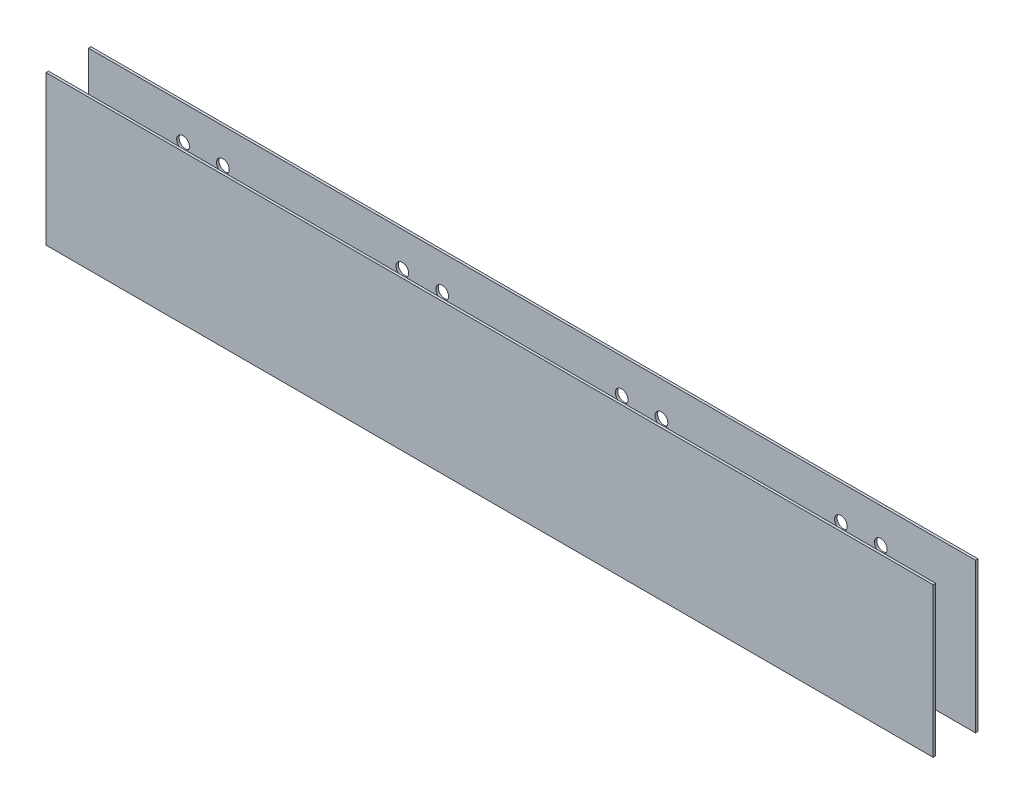
ISO-10303-21;
HEADER;
FILE_DESCRIPTION(('STEP AP214'),'2;1');
FILE_NAME('part.step','',(''),(''),'','','');
FILE_SCHEMA(('AUTOMOTIVE_DESIGN { 1 0 10303 214 1 1 1 1 }'));
ENDSEC;
DATA;
#1=APPLICATION_CONTEXT('core data for automotive mechanical design processes');
#2=APPLICATION_PROTOCOL_DEFINITION('international standard','automotive_design',2000,#1);
#3=PRODUCT_CONTEXT('',#1,'mechanical');
#4=PRODUCT('Part','Part','',(#3));
#5=PRODUCT_RELATED_PRODUCT_CATEGORY('part','',(#4));
#6=PRODUCT_DEFINITION_FORMATION('','',#4);
#7=PRODUCT_DEFINITION_CONTEXT('part definition',#1,'design');
#8=PRODUCT_DEFINITION('design','',#6,#7);
#9=PRODUCT_DEFINITION_SHAPE('','',#8);
#10=(LENGTH_UNIT() NAMED_UNIT(*) SI_UNIT(.MILLI.,.METRE.));
#11=(NAMED_UNIT(*) PLANE_ANGLE_UNIT() SI_UNIT($,.RADIAN.));
#12=(NAMED_UNIT(*) SI_UNIT($,.STERADIAN.) SOLID_ANGLE_UNIT());
#13=UNCERTAINTY_MEASURE_WITH_UNIT(LENGTH_MEASURE(1.E-05),#10,'distance_accuracy_value','');
#14=(GEOMETRIC_REPRESENTATION_CONTEXT(3) GLOBAL_UNCERTAINTY_ASSIGNED_CONTEXT((#13)) GLOBAL_UNIT_ASSIGNED_CONTEXT((#10,
#11,#12)) REPRESENTATION_CONTEXT('',''));
#15=CARTESIAN_POINT('',(0.,0.,0.));
#16=DIRECTION('',(0.,0.,1.));
#17=DIRECTION('',(1.,0.,0.));
#18=AXIS2_PLACEMENT_3D('',#15,#16,#17);
#19=CARTESIAN_POINT('',(890.,150.,40.));
#20=DIRECTION('',(-1.,0.,0.));
#21=DIRECTION('',(0.,0.,1.));
#22=AXIS2_PLACEMENT_3D('',#19,#20,#21);
#23=PLANE('',#22);
#24=DIRECTION('',(0.,0.,-1.));
#25=VECTOR('',#24,1.);
#26=CARTESIAN_POINT('',(890.,-150.,40.));
#27=LINE('',#26,#25);
#28=CARTESIAN_POINT('',(890.,-150.,45.));
#29=VERTEX_POINT('',#28);
#30=CARTESIAN_POINT('',(890.,-150.,40.));
#31=VERTEX_POINT('',#30);
#32=EDGE_CURVE('E12',#29,#31,#27,.T.);
#33=ORIENTED_EDGE('',*,*,#32,.T.);
#34=DIRECTION('',(0.,-1.,0.));
#35=VECTOR('',#34,1.);
#36=CARTESIAN_POINT('',(890.,150.,40.));
#37=LINE('',#36,#35);
#38=CARTESIAN_POINT('',(890.,150.,40.));
#39=VERTEX_POINT('',#38);
#40=EDGE_CURVE('E132',#39,#31,#37,.T.);
#41=ORIENTED_EDGE('',*,*,#40,.F.);
#42=DIRECTION('',(0.,0.,-1.));
#43=VECTOR('',#42,1.);
#44=CARTESIAN_POINT('',(890.,150.,40.));
#45=LINE('',#44,#43);
#46=CARTESIAN_POINT('',(890.,150.,45.));
#47=VERTEX_POINT('',#46);
#48=EDGE_CURVE('E56',#47,#39,#45,.T.);
#49=ORIENTED_EDGE('',*,*,#48,.F.);
#50=DIRECTION('',(0.,-1.,0.));
#51=VECTOR('',#50,1.);
#52=CARTESIAN_POINT('',(890.,150.,45.));
#53=LINE('',#52,#51);
#54=EDGE_CURVE('E114',#47,#29,#53,.T.);
#55=ORIENTED_EDGE('',*,*,#54,.T.);
#56=EDGE_LOOP('',(#33,#41,#49,#55));
#57=FACE_BOUND('',#56,.T.);
#58=ADVANCED_FACE('F52',(#57),#23,.F.);
#59=CARTESIAN_POINT('',(-890.,150.,40.));
#60=DIRECTION('',(0.,0.,1.));
#61=DIRECTION('',(1.,0.,0.));
#62=AXIS2_PLACEMENT_3D('',#59,#60,#61);
#63=PLANE('',#62);
#64=DIRECTION('',(-1.,0.,0.));
#65=VECTOR('',#64,1.);
#66=CARTESIAN_POINT('',(-890.,-150.,40.));
#67=LINE('',#66,#65);
#68=CARTESIAN_POINT('',(-890.,-150.,40.));
#69=VERTEX_POINT('',#68);
#70=EDGE_CURVE('E63',#31,#69,#67,.T.);
#71=ORIENTED_EDGE('',*,*,#70,.T.);
#72=DIRECTION('',(0.,-1.,0.));
#73=VECTOR('',#72,1.);
#74=CARTESIAN_POINT('',(-890.,150.,40.));
#75=LINE('',#74,#73);
#76=CARTESIAN_POINT('',(-890.,150.,40.));
#77=VERTEX_POINT('',#76);
#78=EDGE_CURVE('E108',#77,#69,#75,.T.);
#79=ORIENTED_EDGE('',*,*,#78,.F.);
#80=DIRECTION('',(-1.,0.,0.));
#81=VECTOR('',#80,1.);
#82=CARTESIAN_POINT('',(-890.,150.,40.));
#83=LINE('',#82,#81);
#84=EDGE_CURVE('E87',#39,#77,#83,.T.);
#85=ORIENTED_EDGE('',*,*,#84,.F.);
#86=ORIENTED_EDGE('',*,*,#40,.T.);
#87=EDGE_LOOP('',(#71,#79,#85,#86));
#88=FACE_BOUND('',#87,.T.);
#89=ADVANCED_FACE('F136',(#88),#63,.F.);
#90=CARTESIAN_POINT('',(-890.,150.,40.));
#91=DIRECTION('',(1.,0.,0.));
#92=DIRECTION('',(0.,0.,-1.));
#93=AXIS2_PLACEMENT_3D('',#90,#91,#92);
#94=PLANE('',#93);
#95=DIRECTION('',(0.,0.,1.));
#96=VECTOR('',#95,1.);
#97=CARTESIAN_POINT('',(-890.,-150.,40.));
#98=LINE('',#97,#96);
#99=CARTESIAN_POINT('',(-890.,-150.,45.));
#100=VERTEX_POINT('',#99);
#101=EDGE_CURVE('E103',#69,#100,#98,.T.);
#102=ORIENTED_EDGE('',*,*,#101,.T.);
#103=DIRECTION('',(0.,-1.,0.));
#104=VECTOR('',#103,1.);
#105=CARTESIAN_POINT('',(-890.,150.,45.));
#106=LINE('',#105,#104);
#107=CARTESIAN_POINT('',(-890.,150.,45.));
#108=VERTEX_POINT('',#107);
#109=EDGE_CURVE('E106',#108,#100,#106,.T.);
#110=ORIENTED_EDGE('',*,*,#109,.F.);
#111=DIRECTION('',(0.,0.,1.));
#112=VECTOR('',#111,1.);
#113=CARTESIAN_POINT('',(-890.,150.,40.));
#114=LINE('',#113,#112);
#115=EDGE_CURVE('E126',#77,#108,#114,.T.);
#116=ORIENTED_EDGE('',*,*,#115,.F.);
#117=ORIENTED_EDGE('',*,*,#78,.T.);
#118=EDGE_LOOP('',(#102,#110,#116,#117));
#119=FACE_BOUND('',#118,.T.);
#120=ADVANCED_FACE('F104',(#119),#94,.F.);
#121=CARTESIAN_POINT('',(-890.,150.,45.));
#122=DIRECTION('',(0.,0.,-1.));
#123=DIRECTION('',(-1.,0.,0.));
#124=AXIS2_PLACEMENT_3D('',#121,#122,#123);
#125=PLANE('',#124);
#126=DIRECTION('',(1.,0.,0.));
#127=VECTOR('',#126,1.);
#128=CARTESIAN_POINT('',(-890.,-150.,45.));
#129=LINE('',#128,#127);
#130=EDGE_CURVE('E97',#100,#29,#129,.T.);
#131=ORIENTED_EDGE('',*,*,#130,.T.);
#132=ORIENTED_EDGE('',*,*,#54,.F.);
#133=DIRECTION('',(1.,0.,0.));
#134=VECTOR('',#133,1.);
#135=CARTESIAN_POINT('',(-890.,150.,45.));
#136=LINE('',#135,#134);
#137=EDGE_CURVE('E112',#108,#47,#136,.T.);
#138=ORIENTED_EDGE('',*,*,#137,.F.);
#139=ORIENTED_EDGE('',*,*,#109,.T.);
#140=EDGE_LOOP('',(#131,#132,#138,#139));
#141=FACE_BOUND('',#140,.T.);
#142=ADVANCED_FACE('F111',(#141),#125,.F.);
#143=CARTESIAN_POINT('',(0.,150.,0.));
#144=DIRECTION('',(0.,1.,0.));
#145=DIRECTION('',(0.,0.,1.));
#146=AXIS2_PLACEMENT_3D('',#143,#144,#145);
#147=PLANE('',#146);
#148=ORIENTED_EDGE('',*,*,#48,.T.);
#149=ORIENTED_EDGE('',*,*,#84,.T.);
#150=ORIENTED_EDGE('',*,*,#115,.T.);
#151=ORIENTED_EDGE('',*,*,#137,.T.);
#152=EDGE_LOOP('',(#148,#149,#150,#151));
#153=FACE_BOUND('',#152,.T.);
#154=ADVANCED_FACE('F54',(#153),#147,.T.);
#155=CARTESIAN_POINT('',(0.,-150.,0.));
#156=DIRECTION('',(0.,1.,0.));
#157=DIRECTION('',(0.,0.,1.));
#158=AXIS2_PLACEMENT_3D('',#155,#156,#157);
#159=PLANE('',#158);
#160=ORIENTED_EDGE('',*,*,#32,.F.);
#161=ORIENTED_EDGE('',*,*,#130,.F.);
#162=ORIENTED_EDGE('',*,*,#101,.F.);
#163=ORIENTED_EDGE('',*,*,#70,.F.);
#164=EDGE_LOOP('',(#160,#161,#162,#163));
#165=FACE_BOUND('',#164,.T.);
#166=ADVANCED_FACE('F116',(#165),#159,.F.);
#167=CLOSED_SHELL('',(#58,#89,#120,#142,#154,#166));
#168=MANIFOLD_SOLID_BREP('B2',#167);
#169=CARTESIAN_POINT('',(889.999999999999,150.,-45.));
#170=DIRECTION('',(-1.,0.,0.));
#171=DIRECTION('',(0.,0.,1.));
#172=AXIS2_PLACEMENT_3D('',#169,#170,#171);
#173=PLANE('',#172);
#174=DIRECTION('',(0.,0.,-1.));
#175=VECTOR('',#174,1.);
#176=CARTESIAN_POINT('',(889.999999999999,-150.,-45.));
#177=LINE('',#176,#175);
#178=CARTESIAN_POINT('',(889.999999999999,-150.,-40.));
#179=VERTEX_POINT('',#178);
#180=CARTESIAN_POINT('',(889.999999999999,-150.,-45.));
#181=VERTEX_POINT('',#180);
#182=EDGE_CURVE('E265',#179,#181,#177,.T.);
#183=ORIENTED_EDGE('',*,*,#182,.T.);
#184=DIRECTION('',(0.,-1.,0.));
#185=VECTOR('',#184,1.);
#186=CARTESIAN_POINT('',(889.999999999999,150.,-45.));
#187=LINE('',#186,#185);
#188=CARTESIAN_POINT('',(889.999999999999,150.,-45.));
#189=VERTEX_POINT('',#188);
#190=EDGE_CURVE('E50',#189,#181,#187,.T.);
#191=ORIENTED_EDGE('',*,*,#190,.F.);
#192=DIRECTION('',(0.,0.,-1.));
#193=VECTOR('',#192,1.);
#194=CARTESIAN_POINT('',(889.999999999999,150.,-45.));
#195=LINE('',#194,#193);
#196=CARTESIAN_POINT('',(889.999999999999,150.,-40.));
#197=VERTEX_POINT('',#196);
#198=EDGE_CURVE('E252',#197,#189,#195,.T.);
#199=ORIENTED_EDGE('',*,*,#198,.F.);
#200=DIRECTION('',(0.,-1.,0.));
#201=VECTOR('',#200,1.);
#202=CARTESIAN_POINT('',(889.999999999999,150.,-40.));
#203=LINE('',#202,#201);
#204=EDGE_CURVE('E261',#197,#179,#203,.T.);
#205=ORIENTED_EDGE('',*,*,#204,.T.);
#206=EDGE_LOOP('',(#183,#191,#199,#205));
#207=FACE_BOUND('',#206,.T.);
#208=ADVANCED_FACE('F199',(#207),#173,.F.);
#209=CARTESIAN_POINT('',(-890.000000000001,150.,-45.));
#210=DIRECTION('',(0.,0.,1.));
#211=DIRECTION('',(1.,0.,0.));
#212=AXIS2_PLACEMENT_3D('',#209,#210,#211);
#213=PLANE('',#212);
#214=CARTESIAN_POINT('',(-700.1,80.,-45.));
#215=DIRECTION('',(0.,0.,1.));
#216=DIRECTION('',(1.,0.,0.));
#217=AXIS2_PLACEMENT_3D('',#214,#215,#216);
#218=CIRCLE('',#217,12.75);
#219=CARTESIAN_POINT('',(-687.35,80.,-45.));
#220=VERTEX_POINT('',#219);
#221=EDGE_CURVE('E268',#220,#220,#218,.T.);
#222=ORIENTED_EDGE('',*,*,#221,.T.);
#223=EDGE_LOOP('',(#222));
#224=FACE_BOUND('',#223,.T.);
#225=CARTESIAN_POINT('',(-620.1,80.,-45.));
#226=DIRECTION('',(0.,0.,1.));
#227=DIRECTION('',(1.,0.,0.));
#228=AXIS2_PLACEMENT_3D('',#225,#226,#227);
#229=CIRCLE('',#228,12.75);
#230=CARTESIAN_POINT('',(-607.35,80.,-45.));
#231=VERTEX_POINT('',#230);
#232=EDGE_CURVE('E299',#231,#231,#229,.T.);
#233=ORIENTED_EDGE('',*,*,#232,.T.);
#234=EDGE_LOOP('',(#233));
#235=FACE_BOUND('',#234,.T.);
#236=CARTESIAN_POINT('',(-260.1,80.,-45.));
#237=DIRECTION('',(0.,0.,1.));
#238=DIRECTION('',(1.,0.,0.));
#239=AXIS2_PLACEMENT_3D('',#236,#237,#238);
#240=CIRCLE('',#239,12.75);
#241=CARTESIAN_POINT('',(-247.35,80.,-45.));
#242=VERTEX_POINT('',#241);
#243=EDGE_CURVE('E296',#242,#242,#240,.T.);
#244=ORIENTED_EDGE('',*,*,#243,.T.);
#245=EDGE_LOOP('',(#244));
#246=FACE_BOUND('',#245,.T.);
#247=CARTESIAN_POINT('',(-180.1,80.,-45.));
#248=DIRECTION('',(0.,0.,1.));
#249=DIRECTION('',(1.,0.,0.));
#250=AXIS2_PLACEMENT_3D('',#247,#248,#249);
#251=CIRCLE('',#250,12.75);
#252=CARTESIAN_POINT('',(-167.35,80.,-45.));
#253=VERTEX_POINT('',#252);
#254=EDGE_CURVE('E293',#253,#253,#251,.T.);
#255=ORIENTED_EDGE('',*,*,#254,.T.);
#256=EDGE_LOOP('',(#255));
#257=FACE_BOUND('',#256,.T.);
#258=CARTESIAN_POINT('',(179.9,80.,-45.));
#259=DIRECTION('',(0.,0.,1.));
#260=DIRECTION('',(1.,0.,0.));
#261=AXIS2_PLACEMENT_3D('',#258,#259,#260);
#262=CIRCLE('',#261,12.75);
#263=CARTESIAN_POINT('',(192.65,80.,-45.));
#264=VERTEX_POINT('',#263);
#265=EDGE_CURVE('E289',#264,#264,#262,.T.);
#266=ORIENTED_EDGE('',*,*,#265,.T.);
#267=EDGE_LOOP('',(#266));
#268=FACE_BOUND('',#267,.T.);
#269=CARTESIAN_POINT('',(259.9,80.,-45.));
#270=DIRECTION('',(0.,0.,1.));
#271=DIRECTION('',(1.,0.,0.));
#272=AXIS2_PLACEMENT_3D('',#269,#270,#271);
#273=CIRCLE('',#272,12.75);
#274=CARTESIAN_POINT('',(272.65,80.,-45.));
#275=VERTEX_POINT('',#274);
#276=EDGE_CURVE('E285',#275,#275,#273,.T.);
#277=ORIENTED_EDGE('',*,*,#276,.T.);
#278=EDGE_LOOP('',(#277));
#279=FACE_BOUND('',#278,.T.);
#280=CARTESIAN_POINT('',(619.9,80.,-45.));
#281=DIRECTION('',(0.,0.,1.));
#282=DIRECTION('',(1.,0.,0.));
#283=AXIS2_PLACEMENT_3D('',#280,#281,#282);
#284=CIRCLE('',#283,12.7500000000003);
#285=CARTESIAN_POINT('',(632.650000000001,80.,-45.));
#286=VERTEX_POINT('',#285);
#287=EDGE_CURVE('E281',#286,#286,#284,.T.);
#288=ORIENTED_EDGE('',*,*,#287,.T.);
#289=EDGE_LOOP('',(#288));
#290=FACE_BOUND('',#289,.T.);
#291=CARTESIAN_POINT('',(699.9,80.,-45.));
#292=DIRECTION('',(0.,0.,1.));
#293=DIRECTION('',(1.,0.,0.));
#294=AXIS2_PLACEMENT_3D('',#291,#292,#293);
#295=CIRCLE('',#294,12.7500000000003);
#296=CARTESIAN_POINT('',(712.65,80.,-45.));
#297=VERTEX_POINT('',#296);
#298=EDGE_CURVE('E277',#297,#297,#295,.T.);
#299=ORIENTED_EDGE('',*,*,#298,.T.);
#300=EDGE_LOOP('',(#299));
#301=FACE_BOUND('',#300,.T.);
#302=DIRECTION('',(-1.,0.,0.));
#303=VECTOR('',#302,1.);
#304=CARTESIAN_POINT('',(-890.000000000001,-150.,-45.));
#305=LINE('',#304,#303);
#306=CARTESIAN_POINT('',(-890.000000000001,-150.,-45.));
#307=VERTEX_POINT('',#306);
#308=EDGE_CURVE('E256',#181,#307,#305,.T.);
#309=ORIENTED_EDGE('',*,*,#308,.T.);
#310=DIRECTION('',(0.,-1.,0.));
#311=VECTOR('',#310,1.);
#312=CARTESIAN_POINT('',(-890.000000000001,150.,-45.));
#313=LINE('',#312,#311);
#314=CARTESIAN_POINT('',(-890.000000000001,150.,-45.));
#315=VERTEX_POINT('',#314);
#316=EDGE_CURVE('E208',#315,#307,#313,.T.);
#317=ORIENTED_EDGE('',*,*,#316,.F.);
#318=DIRECTION('',(-1.,0.,0.));
#319=VECTOR('',#318,1.);
#320=CARTESIAN_POINT('',(-890.000000000001,150.,-45.));
#321=LINE('',#320,#319);
#322=EDGE_CURVE('E247',#189,#315,#321,.T.);
#323=ORIENTED_EDGE('',*,*,#322,.F.);
#324=ORIENTED_EDGE('',*,*,#190,.T.);
#325=EDGE_LOOP('',(#309,#317,#323,#324));
#326=FACE_BOUND('',#325,.T.);
#327=ADVANCED_FACE('F255',(#224,#235,#246,#257,#268,#279,#290,#301,#326),#213,.F.);
#328=CARTESIAN_POINT('',(-890.000000000001,150.,-45.));
#329=DIRECTION('',(1.,0.,0.));
#330=DIRECTION('',(0.,0.,-1.));
#331=AXIS2_PLACEMENT_3D('',#328,#329,#330);
#332=PLANE('',#331);
#333=DIRECTION('',(0.,0.,1.));
#334=VECTOR('',#333,1.);
#335=CARTESIAN_POINT('',(-890.000000000001,-150.,-45.));
#336=LINE('',#335,#334);
#337=CARTESIAN_POINT('',(-890.000000000001,-150.,-40.));
#338=VERTEX_POINT('',#337);
#339=EDGE_CURVE('E234',#307,#338,#336,.T.);
#340=ORIENTED_EDGE('',*,*,#339,.T.);
#341=DIRECTION('',(0.,-1.,0.));
#342=VECTOR('',#341,1.);
#343=CARTESIAN_POINT('',(-890.000000000001,150.,-40.));
#344=LINE('',#343,#342);
#345=CARTESIAN_POINT('',(-890.000000000001,150.,-40.));
#346=VERTEX_POINT('',#345);
#347=EDGE_CURVE('E257',#346,#338,#344,.T.);
#348=ORIENTED_EDGE('',*,*,#347,.F.);
#349=DIRECTION('',(0.,0.,1.));
#350=VECTOR('',#349,1.);
#351=CARTESIAN_POINT('',(-890.000000000001,150.,-45.));
#352=LINE('',#351,#350);
#353=EDGE_CURVE('E250',#315,#346,#352,.T.);
#354=ORIENTED_EDGE('',*,*,#353,.F.);
#355=ORIENTED_EDGE('',*,*,#316,.T.);
#356=EDGE_LOOP('',(#340,#348,#354,#355));
#357=FACE_BOUND('',#356,.T.);
#358=ADVANCED_FACE('F259',(#357),#332,.F.);
#359=CARTESIAN_POINT('',(-890.000000000001,150.,-40.));
#360=DIRECTION('',(0.,0.,-1.));
#361=DIRECTION('',(-1.,0.,0.));
#362=AXIS2_PLACEMENT_3D('',#359,#360,#361);
#363=PLANE('',#362);
#364=CARTESIAN_POINT('',(-700.1,80.,-40.));
#365=DIRECTION('',(0.,0.,-1.));
#366=DIRECTION('',(-1.,0.,0.));
#367=AXIS2_PLACEMENT_3D('',#364,#365,#366);
#368=CIRCLE('',#367,12.75);
#369=CARTESIAN_POINT('',(-712.85,80.,-40.));
#370=VERTEX_POINT('',#369);
#371=EDGE_CURVE('E202',#370,#370,#368,.T.);
#372=ORIENTED_EDGE('',*,*,#371,.T.);
#373=EDGE_LOOP('',(#372));
#374=FACE_BOUND('',#373,.T.);
#375=CARTESIAN_POINT('',(-620.1,80.,-40.));
#376=DIRECTION('',(0.,0.,-1.));
#377=DIRECTION('',(-1.,0.,0.));
#378=AXIS2_PLACEMENT_3D('',#375,#376,#377);
#379=CIRCLE('',#378,12.75);
#380=CARTESIAN_POINT('',(-632.85,80.,-40.));
#381=VERTEX_POINT('',#380);
#382=EDGE_CURVE('E297',#381,#381,#379,.T.);
#383=ORIENTED_EDGE('',*,*,#382,.T.);
#384=EDGE_LOOP('',(#383));
#385=FACE_BOUND('',#384,.T.);
#386=CARTESIAN_POINT('',(-260.1,80.,-40.));
#387=DIRECTION('',(0.,0.,-1.));
#388=DIRECTION('',(-1.,0.,0.));
#389=AXIS2_PLACEMENT_3D('',#386,#387,#388);
#390=CIRCLE('',#389,12.75);
#391=CARTESIAN_POINT('',(-272.85,80.,-40.));
#392=VERTEX_POINT('',#391);
#393=EDGE_CURVE('E294',#392,#392,#390,.T.);
#394=ORIENTED_EDGE('',*,*,#393,.T.);
#395=EDGE_LOOP('',(#394));
#396=FACE_BOUND('',#395,.T.);
#397=CARTESIAN_POINT('',(-180.1,80.,-40.));
#398=DIRECTION('',(0.,0.,-1.));
#399=DIRECTION('',(-1.,0.,0.));
#400=AXIS2_PLACEMENT_3D('',#397,#398,#399);
#401=CIRCLE('',#400,12.75);
#402=CARTESIAN_POINT('',(-192.85,80.,-40.));
#403=VERTEX_POINT('',#402);
#404=EDGE_CURVE('E290',#403,#403,#401,.T.);
#405=ORIENTED_EDGE('',*,*,#404,.T.);
#406=EDGE_LOOP('',(#405));
#407=FACE_BOUND('',#406,.T.);
#408=CARTESIAN_POINT('',(179.9,80.,-40.));
#409=DIRECTION('',(0.,0.,-1.));
#410=DIRECTION('',(-1.,0.,0.));
#411=AXIS2_PLACEMENT_3D('',#408,#409,#410);
#412=CIRCLE('',#411,12.75);
#413=CARTESIAN_POINT('',(167.15,80.,-40.));
#414=VERTEX_POINT('',#413);
#415=EDGE_CURVE('E286',#414,#414,#412,.T.);
#416=ORIENTED_EDGE('',*,*,#415,.T.);
#417=EDGE_LOOP('',(#416));
#418=FACE_BOUND('',#417,.T.);
#419=CARTESIAN_POINT('',(259.9,80.,-40.));
#420=DIRECTION('',(0.,0.,-1.));
#421=DIRECTION('',(-1.,0.,0.));
#422=AXIS2_PLACEMENT_3D('',#419,#420,#421);
#423=CIRCLE('',#422,12.75);
#424=CARTESIAN_POINT('',(247.15,80.,-40.));
#425=VERTEX_POINT('',#424);
#426=EDGE_CURVE('E282',#425,#425,#423,.T.);
#427=ORIENTED_EDGE('',*,*,#426,.T.);
#428=EDGE_LOOP('',(#427));
#429=FACE_BOUND('',#428,.T.);
#430=CARTESIAN_POINT('',(619.9,80.,-40.));
#431=DIRECTION('',(0.,0.,-1.));
#432=DIRECTION('',(-1.,0.,0.));
#433=AXIS2_PLACEMENT_3D('',#430,#431,#432);
#434=CIRCLE('',#433,12.7500000000003);
#435=CARTESIAN_POINT('',(607.15,80.,-40.));
#436=VERTEX_POINT('',#435);
#437=EDGE_CURVE('E278',#436,#436,#434,.T.);
#438=ORIENTED_EDGE('',*,*,#437,.T.);
#439=EDGE_LOOP('',(#438));
#440=FACE_BOUND('',#439,.T.);
#441=CARTESIAN_POINT('',(699.9,80.,-40.));
#442=DIRECTION('',(0.,0.,-1.));
#443=DIRECTION('',(-1.,0.,0.));
#444=AXIS2_PLACEMENT_3D('',#441,#442,#443);
#445=CIRCLE('',#444,12.7500000000003);
#446=CARTESIAN_POINT('',(687.15,80.,-40.));
#447=VERTEX_POINT('',#446);
#448=EDGE_CURVE('E274',#447,#447,#445,.T.);
#449=ORIENTED_EDGE('',*,*,#448,.T.);
#450=EDGE_LOOP('',(#449));
#451=FACE_BOUND('',#450,.T.);
#452=DIRECTION('',(1.,0.,0.));
#453=VECTOR('',#452,1.);
#454=CARTESIAN_POINT('',(-890.000000000001,-150.,-40.));
#455=LINE('',#454,#453);
#456=EDGE_CURVE('E240',#338,#179,#455,.T.);
#457=ORIENTED_EDGE('',*,*,#456,.T.);
#458=ORIENTED_EDGE('',*,*,#204,.F.);
#459=DIRECTION('',(1.,0.,0.));
#460=VECTOR('',#459,1.);
#461=CARTESIAN_POINT('',(-890.000000000001,150.,-40.));
#462=LINE('',#461,#460);
#463=EDGE_CURVE('E217',#346,#197,#462,.T.);
#464=ORIENTED_EDGE('',*,*,#463,.F.);
#465=ORIENTED_EDGE('',*,*,#347,.T.);
#466=EDGE_LOOP('',(#457,#458,#464,#465));
#467=FACE_BOUND('',#466,.T.);
#468=ADVANCED_FACE('F317',(#374,#385,#396,#407,#418,#429,#440,#451,#467),#363,.F.);
#469=CARTESIAN_POINT('',(0.,150.,0.));
#470=DIRECTION('',(0.,1.,0.));
#471=DIRECTION('',(0.,0.,1.));
#472=AXIS2_PLACEMENT_3D('',#469,#470,#471);
#473=PLANE('',#472);
#474=ORIENTED_EDGE('',*,*,#198,.T.);
#475=ORIENTED_EDGE('',*,*,#322,.T.);
#476=ORIENTED_EDGE('',*,*,#353,.T.);
#477=ORIENTED_EDGE('',*,*,#463,.T.);
#478=EDGE_LOOP('',(#474,#475,#476,#477));
#479=FACE_BOUND('',#478,.T.);
#480=ADVANCED_FACE('F248',(#479),#473,.T.);
#481=CARTESIAN_POINT('',(0.,-150.,0.));
#482=DIRECTION('',(0.,1.,0.));
#483=DIRECTION('',(0.,0.,1.));
#484=AXIS2_PLACEMENT_3D('',#481,#482,#483);
#485=PLANE('',#484);
#486=ORIENTED_EDGE('',*,*,#182,.F.);
#487=ORIENTED_EDGE('',*,*,#456,.F.);
#488=ORIENTED_EDGE('',*,*,#339,.F.);
#489=ORIENTED_EDGE('',*,*,#308,.F.);
#490=EDGE_LOOP('',(#486,#487,#488,#489));
#491=FACE_BOUND('',#490,.T.);
#492=ADVANCED_FACE('F337',(#491),#485,.F.);
#493=CARTESIAN_POINT('',(699.9,80.,-1.00000000000002));
#494=DIRECTION('',(0.,0.,-1.));
#495=DIRECTION('',(-1.,0.,0.));
#496=AXIS2_PLACEMENT_3D('',#493,#494,#495);
#497=CYLINDRICAL_SURFACE('',#496,12.7500000000003);
#498=ORIENTED_EDGE('',*,*,#448,.F.);
#499=EDGE_LOOP('',(#498));
#500=FACE_BOUND('',#499,.T.);
#501=ORIENTED_EDGE('',*,*,#298,.F.);
#502=EDGE_LOOP('',(#501));
#503=FACE_BOUND('',#502,.T.);
#504=ADVANCED_FACE('F339',(#500,#503),#497,.F.);
#505=CARTESIAN_POINT('',(619.9,80.,-1.00000000000002));
#506=DIRECTION('',(0.,0.,-1.));
#507=DIRECTION('',(-1.,0.,0.));
#508=AXIS2_PLACEMENT_3D('',#505,#506,#507);
#509=CYLINDRICAL_SURFACE('',#508,12.7500000000003);
#510=ORIENTED_EDGE('',*,*,#437,.F.);
#511=EDGE_LOOP('',(#510));
#512=FACE_BOUND('',#511,.T.);
#513=ORIENTED_EDGE('',*,*,#287,.F.);
#514=EDGE_LOOP('',(#513));
#515=FACE_BOUND('',#514,.T.);
#516=ADVANCED_FACE('F345',(#512,#515),#509,.F.);
#517=CARTESIAN_POINT('',(259.9,80.,-1.00000000000002));
#518=DIRECTION('',(0.,0.,-1.));
#519=DIRECTION('',(-1.,0.,0.));
#520=AXIS2_PLACEMENT_3D('',#517,#518,#519);
#521=CYLINDRICAL_SURFACE('',#520,12.75);
#522=ORIENTED_EDGE('',*,*,#426,.F.);
#523=EDGE_LOOP('',(#522));
#524=FACE_BOUND('',#523,.T.);
#525=ORIENTED_EDGE('',*,*,#276,.F.);
#526=EDGE_LOOP('',(#525));
#527=FACE_BOUND('',#526,.T.);
#528=ADVANCED_FACE('F406',(#524,#527),#521,.F.);
#529=CARTESIAN_POINT('',(179.9,80.,-1.00000000000002));
#530=DIRECTION('',(0.,0.,-1.));
#531=DIRECTION('',(-1.,0.,0.));
#532=AXIS2_PLACEMENT_3D('',#529,#530,#531);
#533=CYLINDRICAL_SURFACE('',#532,12.75);
#534=ORIENTED_EDGE('',*,*,#415,.F.);
#535=EDGE_LOOP('',(#534));
#536=FACE_BOUND('',#535,.T.);
#537=ORIENTED_EDGE('',*,*,#265,.F.);
#538=EDGE_LOOP('',(#537));
#539=FACE_BOUND('',#538,.T.);
#540=ADVANCED_FACE('F416',(#536,#539),#533,.F.);
#541=CARTESIAN_POINT('',(-180.1,80.,-1.00000000000003));
#542=DIRECTION('',(0.,0.,-1.));
#543=DIRECTION('',(-1.,0.,0.));
#544=AXIS2_PLACEMENT_3D('',#541,#542,#543);
#545=CYLINDRICAL_SURFACE('',#544,12.75);
#546=ORIENTED_EDGE('',*,*,#404,.F.);
#547=EDGE_LOOP('',(#546));
#548=FACE_BOUND('',#547,.T.);
#549=ORIENTED_EDGE('',*,*,#254,.F.);
#550=EDGE_LOOP('',(#549));
#551=FACE_BOUND('',#550,.T.);
#552=ADVANCED_FACE('F426',(#548,#551),#545,.F.);
#553=CARTESIAN_POINT('',(-260.1,80.,-1.00000000000003));
#554=DIRECTION('',(0.,0.,-1.));
#555=DIRECTION('',(-1.,0.,0.));
#556=AXIS2_PLACEMENT_3D('',#553,#554,#555);
#557=CYLINDRICAL_SURFACE('',#556,12.75);
#558=ORIENTED_EDGE('',*,*,#393,.F.);
#559=EDGE_LOOP('',(#558));
#560=FACE_BOUND('',#559,.T.);
#561=ORIENTED_EDGE('',*,*,#243,.F.);
#562=EDGE_LOOP('',(#561));
#563=FACE_BOUND('',#562,.T.);
#564=ADVANCED_FACE('F327',(#560,#563),#557,.F.);
#565=CARTESIAN_POINT('',(-620.1,80.,-1.00000000000003));
#566=DIRECTION('',(0.,0.,-1.));
#567=DIRECTION('',(-1.,0.,0.));
#568=AXIS2_PLACEMENT_3D('',#565,#566,#567);
#569=CYLINDRICAL_SURFACE('',#568,12.75);
#570=ORIENTED_EDGE('',*,*,#382,.F.);
#571=EDGE_LOOP('',(#570));
#572=FACE_BOUND('',#571,.T.);
#573=ORIENTED_EDGE('',*,*,#232,.F.);
#574=EDGE_LOOP('',(#573));
#575=FACE_BOUND('',#574,.T.);
#576=ADVANCED_FACE('F322',(#572,#575),#569,.F.);
#577=CARTESIAN_POINT('',(-700.1,80.,-1.00000000000003));
#578=DIRECTION('',(0.,0.,-1.));
#579=DIRECTION('',(-1.,0.,0.));
#580=AXIS2_PLACEMENT_3D('',#577,#578,#579);
#581=CYLINDRICAL_SURFACE('',#580,12.75);
#582=ORIENTED_EDGE('',*,*,#371,.F.);
#583=EDGE_LOOP('',(#582));
#584=FACE_BOUND('',#583,.T.);
#585=ORIENTED_EDGE('',*,*,#221,.F.);
#586=EDGE_LOOP('',(#585));
#587=FACE_BOUND('',#586,.T.);
#588=ADVANCED_FACE('F319',(#584,#587),#581,.F.);
#589=CLOSED_SHELL('',(#208,#327,#358,#468,#480,#492,#504,#516,#528,#540,#552,#564,#576,#588));
#590=MANIFOLD_SOLID_BREP('B6',#589);
#591=ADVANCED_BREP_SHAPE_REPRESENTATION('',(#18,#168,#590),#14);
#592=SHAPE_DEFINITION_REPRESENTATION(#9,#591);
ENDSEC;
END-ISO-10303-21;
